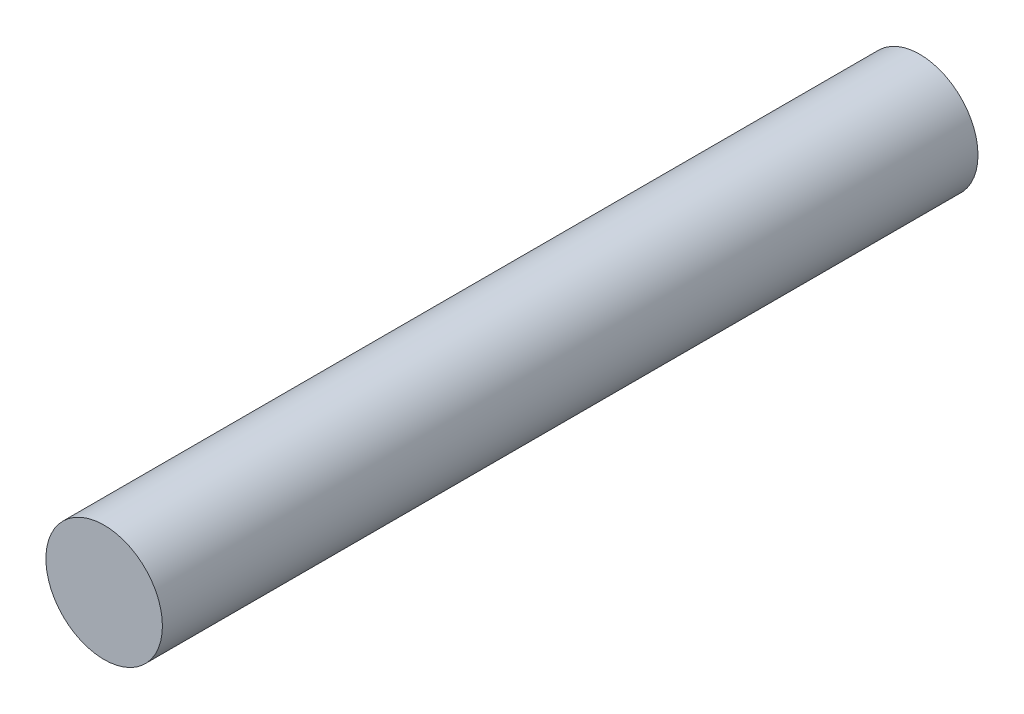
ISO-10303-21;
HEADER;
FILE_DESCRIPTION(('STEP AP214'),'2;1');
FILE_NAME('part.step','',(''),(''),'','','');
FILE_SCHEMA(('AUTOMOTIVE_DESIGN { 1 0 10303 214 1 1 1 1 }'));
ENDSEC;
DATA;
#1=APPLICATION_CONTEXT('core data for automotive mechanical design processes');
#2=APPLICATION_PROTOCOL_DEFINITION('international standard','automotive_design',2000,#1);
#3=PRODUCT_CONTEXT('',#1,'mechanical');
#4=PRODUCT('Part','Part','',(#3));
#5=PRODUCT_RELATED_PRODUCT_CATEGORY('part','',(#4));
#6=PRODUCT_DEFINITION_FORMATION('','',#4);
#7=PRODUCT_DEFINITION_CONTEXT('part definition',#1,'design');
#8=PRODUCT_DEFINITION('design','',#6,#7);
#9=PRODUCT_DEFINITION_SHAPE('','',#8);
#10=(LENGTH_UNIT() NAMED_UNIT(*) SI_UNIT(.MILLI.,.METRE.));
#11=(NAMED_UNIT(*) PLANE_ANGLE_UNIT() SI_UNIT($,.RADIAN.));
#12=(NAMED_UNIT(*) SI_UNIT($,.STERADIAN.) SOLID_ANGLE_UNIT());
#13=UNCERTAINTY_MEASURE_WITH_UNIT(LENGTH_MEASURE(1.E-05),#10,'distance_accuracy_value','');
#14=(GEOMETRIC_REPRESENTATION_CONTEXT(3) GLOBAL_UNCERTAINTY_ASSIGNED_CONTEXT((#13)) GLOBAL_UNIT_ASSIGNED_CONTEXT((#10,
#11,#12)) REPRESENTATION_CONTEXT('',''));
#15=CARTESIAN_POINT('',(0.,0.,0.));
#16=DIRECTION('',(0.,0.,1.));
#17=DIRECTION('',(1.,0.,0.));
#18=AXIS2_PLACEMENT_3D('',#15,#16,#17);
#19=CARTESIAN_POINT('',(0.,0.,177.8));
#20=DIRECTION('',(0.,0.,-1.));
#21=DIRECTION('',(-1.,0.,0.));
#22=AXIS2_PLACEMENT_3D('',#19,#20,#21);
#23=CYLINDRICAL_SURFACE('',#22,12.7);
#24=CARTESIAN_POINT('',(0.,0.,177.8));
#25=DIRECTION('',(0.,0.,1.));
#26=DIRECTION('',(1.,0.,0.));
#27=AXIS2_PLACEMENT_3D('',#24,#25,#26);
#28=CIRCLE('',#27,12.7);
#29=CARTESIAN_POINT('',(12.7,0.,177.8));
#30=VERTEX_POINT('',#29);
#31=EDGE_CURVE('E10',#30,#30,#28,.T.);
#32=ORIENTED_EDGE('',*,*,#31,.F.);
#33=EDGE_LOOP('',(#32));
#34=FACE_BOUND('',#33,.T.);
#35=CARTESIAN_POINT('',(0.,0.,0.));
#36=DIRECTION('',(0.,0.,1.));
#37=DIRECTION('',(1.,0.,0.));
#38=AXIS2_PLACEMENT_3D('',#35,#36,#37);
#39=CIRCLE('',#38,12.7);
#40=CARTESIAN_POINT('',(12.7,0.,0.));
#41=VERTEX_POINT('',#40);
#42=EDGE_CURVE('E45',#41,#41,#39,.T.);
#43=ORIENTED_EDGE('',*,*,#42,.T.);
#44=EDGE_LOOP('',(#43));
#45=FACE_BOUND('',#44,.T.);
#46=ADVANCED_FACE('F42',(#34,#45),#23,.T.);
#47=CARTESIAN_POINT('',(0.,0.,177.8));
#48=DIRECTION('',(0.,0.,1.));
#49=DIRECTION('',(1.,0.,0.));
#50=AXIS2_PLACEMENT_3D('',#47,#48,#49);
#51=PLANE('',#50);
#52=ORIENTED_EDGE('',*,*,#31,.T.);
#53=EDGE_LOOP('',(#52));
#54=FACE_BOUND('',#53,.T.);
#55=ADVANCED_FACE('F57',(#54),#51,.T.);
#56=CARTESIAN_POINT('',(0.,0.,0.));
#57=DIRECTION('',(0.,0.,1.));
#58=DIRECTION('',(1.,0.,0.));
#59=AXIS2_PLACEMENT_3D('',#56,#57,#58);
#60=PLANE('',#59);
#61=ORIENTED_EDGE('',*,*,#42,.F.);
#62=EDGE_LOOP('',(#61));
#63=FACE_BOUND('',#62,.T.);
#64=ADVANCED_FACE('F55',(#63),#60,.F.);
#65=CLOSED_SHELL('',(#46,#55,#64));
#66=MANIFOLD_SOLID_BREP('B2',#65);
#67=ADVANCED_BREP_SHAPE_REPRESENTATION('',(#18,#66),#14);
#68=SHAPE_DEFINITION_REPRESENTATION(#9,#67);
ENDSEC;
END-ISO-10303-21;
